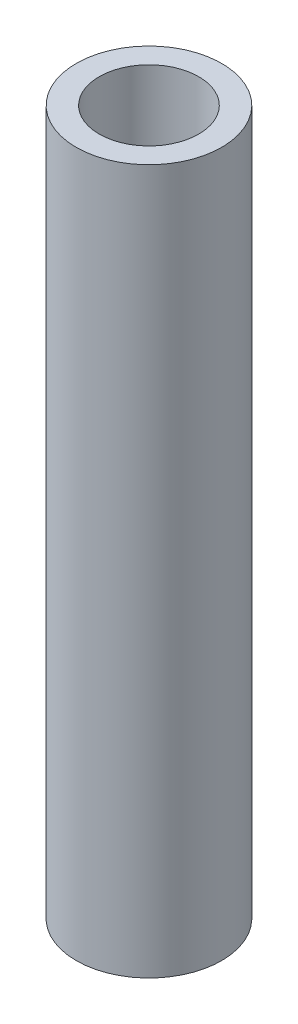
ISO-10303-21;
HEADER;
FILE_DESCRIPTION(('STEP AP214'),'2;1');
FILE_NAME('part.step','',(''),(''),'','','');
FILE_SCHEMA(('AUTOMOTIVE_DESIGN { 1 0 10303 214 1 1 1 1 }'));
ENDSEC;
DATA;
#1=APPLICATION_CONTEXT('core data for automotive mechanical design processes');
#2=APPLICATION_PROTOCOL_DEFINITION('international standard','automotive_design',2000,#1);
#3=PRODUCT_CONTEXT('',#1,'mechanical');
#4=PRODUCT('Part','Part','',(#3));
#5=PRODUCT_RELATED_PRODUCT_CATEGORY('part','',(#4));
#6=PRODUCT_DEFINITION_FORMATION('','',#4);
#7=PRODUCT_DEFINITION_CONTEXT('part definition',#1,'design');
#8=PRODUCT_DEFINITION('design','',#6,#7);
#9=PRODUCT_DEFINITION_SHAPE('','',#8);
#10=(LENGTH_UNIT() NAMED_UNIT(*) SI_UNIT(.MILLI.,.METRE.));
#11=(NAMED_UNIT(*) PLANE_ANGLE_UNIT() SI_UNIT($,.RADIAN.));
#12=(NAMED_UNIT(*) SI_UNIT($,.STERADIAN.) SOLID_ANGLE_UNIT());
#13=UNCERTAINTY_MEASURE_WITH_UNIT(LENGTH_MEASURE(1.E-05),#10,'distance_accuracy_value','');
#14=(GEOMETRIC_REPRESENTATION_CONTEXT(3) GLOBAL_UNCERTAINTY_ASSIGNED_CONTEXT((#13)) GLOBAL_UNIT_ASSIGNED_CONTEXT((#10,
#11,#12)) REPRESENTATION_CONTEXT('',''));
#15=CARTESIAN_POINT('',(0.,0.,0.));
#16=DIRECTION('',(0.,0.,1.));
#17=DIRECTION('',(1.,0.,0.));
#18=AXIS2_PLACEMENT_3D('',#15,#16,#17);
#19=CARTESIAN_POINT('',(0.,46.,0.));
#20=DIRECTION('',(0.,1.,0.));
#21=DIRECTION('',(0.,0.,1.));
#22=AXIS2_PLACEMENT_3D('',#19,#20,#21);
#23=PLANE('',#22);
#24=CARTESIAN_POINT('',(0.,46.,0.));
#25=DIRECTION('',(0.,1.,0.));
#26=DIRECTION('',(0.,0.,1.));
#27=AXIS2_PLACEMENT_3D('',#24,#25,#26);
#28=CIRCLE('',#27,4.75);
#29=CARTESIAN_POINT('',(0.,46.,4.75));
#30=VERTEX_POINT('',#29);
#31=EDGE_CURVE('E10',#30,#30,#28,.T.);
#32=ORIENTED_EDGE('',*,*,#31,.T.);
#33=EDGE_LOOP('',(#32));
#34=FACE_BOUND('',#33,.T.);
#35=CARTESIAN_POINT('',(0.,46.,0.));
#36=DIRECTION('',(0.,1.,0.));
#37=DIRECTION('',(0.,0.,1.));
#38=AXIS2_PLACEMENT_3D('',#35,#36,#37);
#39=CIRCLE('',#38,3.25);
#40=CARTESIAN_POINT('',(0.,46.,3.25));
#41=VERTEX_POINT('',#40);
#42=EDGE_CURVE('E56',#41,#41,#39,.T.);
#43=ORIENTED_EDGE('',*,*,#42,.F.);
#44=EDGE_LOOP('',(#43));
#45=FACE_BOUND('',#44,.T.);
#46=ADVANCED_FACE('F43',(#34,#45),#23,.T.);
#47=CARTESIAN_POINT('',(0.,0.,0.));
#48=DIRECTION('',(0.,1.,0.));
#49=DIRECTION('',(0.,0.,1.));
#50=AXIS2_PLACEMENT_3D('',#47,#48,#49);
#51=PLANE('',#50);
#52=CARTESIAN_POINT('',(0.,0.,0.));
#53=DIRECTION('',(0.,1.,0.));
#54=DIRECTION('',(0.,0.,1.));
#55=AXIS2_PLACEMENT_3D('',#52,#53,#54);
#56=CIRCLE('',#55,4.75);
#57=CARTESIAN_POINT('',(0.,0.,4.75));
#58=VERTEX_POINT('',#57);
#59=EDGE_CURVE('E47',#58,#58,#56,.T.);
#60=ORIENTED_EDGE('',*,*,#59,.F.);
#61=EDGE_LOOP('',(#60));
#62=FACE_BOUND('',#61,.T.);
#63=CARTESIAN_POINT('',(0.,0.,0.));
#64=DIRECTION('',(0.,1.,0.));
#65=DIRECTION('',(0.,0.,1.));
#66=AXIS2_PLACEMENT_3D('',#63,#64,#65);
#67=CIRCLE('',#66,3.25);
#68=CARTESIAN_POINT('',(0.,0.,3.25));
#69=VERTEX_POINT('',#68);
#70=EDGE_CURVE('E58',#69,#69,#67,.T.);
#71=ORIENTED_EDGE('',*,*,#70,.T.);
#72=EDGE_LOOP('',(#71));
#73=FACE_BOUND('',#72,.T.);
#74=ADVANCED_FACE('F70',(#62,#73),#51,.F.);
#75=CARTESIAN_POINT('',(0.,46.,0.));
#76=DIRECTION('',(0.,-1.,0.));
#77=DIRECTION('',(0.,0.,-1.));
#78=AXIS2_PLACEMENT_3D('',#75,#76,#77);
#79=CYLINDRICAL_SURFACE('',#78,4.75);
#80=ORIENTED_EDGE('',*,*,#31,.F.);
#81=EDGE_LOOP('',(#80));
#82=FACE_BOUND('',#81,.T.);
#83=ORIENTED_EDGE('',*,*,#59,.T.);
#84=EDGE_LOOP('',(#83));
#85=FACE_BOUND('',#84,.T.);
#86=ADVANCED_FACE('F45',(#82,#85),#79,.T.);
#87=CARTESIAN_POINT('',(0.,46.,0.));
#88=DIRECTION('',(0.,-1.,0.));
#89=DIRECTION('',(0.,0.,-1.));
#90=AXIS2_PLACEMENT_3D('',#87,#88,#89);
#91=CYLINDRICAL_SURFACE('',#90,3.25);
#92=ORIENTED_EDGE('',*,*,#42,.T.);
#93=EDGE_LOOP('',(#92));
#94=FACE_BOUND('',#93,.T.);
#95=ORIENTED_EDGE('',*,*,#70,.F.);
#96=EDGE_LOOP('',(#95));
#97=FACE_BOUND('',#96,.T.);
#98=ADVANCED_FACE('F66',(#94,#97),#91,.F.);
#99=CLOSED_SHELL('',(#46,#74,#86,#98));
#100=MANIFOLD_SOLID_BREP('B2',#99);
#101=ADVANCED_BREP_SHAPE_REPRESENTATION('',(#18,#100),#14);
#102=SHAPE_DEFINITION_REPRESENTATION(#9,#101);
ENDSEC;
END-ISO-10303-21;
